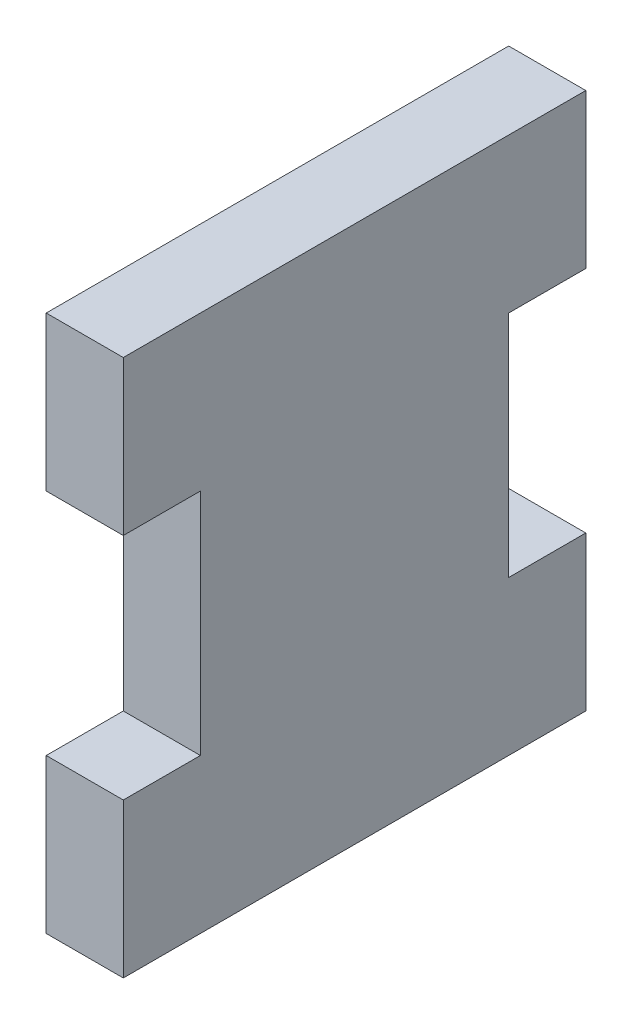
ISO-10303-21;
HEADER;
FILE_DESCRIPTION(('STEP AP214'),'2;1');
FILE_NAME('part.step','',(''),(''),'','','');
FILE_SCHEMA(('AUTOMOTIVE_DESIGN { 1 0 10303 214 1 1 1 1 }'));
ENDSEC;
DATA;
#1=APPLICATION_CONTEXT('core data for automotive mechanical design processes');
#2=APPLICATION_PROTOCOL_DEFINITION('international standard','automotive_design',2000,#1);
#3=PRODUCT_CONTEXT('',#1,'mechanical');
#4=PRODUCT('Part','Part','',(#3));
#5=PRODUCT_RELATED_PRODUCT_CATEGORY('part','',(#4));
#6=PRODUCT_DEFINITION_FORMATION('','',#4);
#7=PRODUCT_DEFINITION_CONTEXT('part definition',#1,'design');
#8=PRODUCT_DEFINITION('design','',#6,#7);
#9=PRODUCT_DEFINITION_SHAPE('','',#8);
#10=(LENGTH_UNIT() NAMED_UNIT(*) SI_UNIT(.MILLI.,.METRE.));
#11=(NAMED_UNIT(*) PLANE_ANGLE_UNIT() SI_UNIT($,.RADIAN.));
#12=(NAMED_UNIT(*) SI_UNIT($,.STERADIAN.) SOLID_ANGLE_UNIT());
#13=UNCERTAINTY_MEASURE_WITH_UNIT(LENGTH_MEASURE(1.E-05),#10,'distance_accuracy_value','');
#14=(GEOMETRIC_REPRESENTATION_CONTEXT(3) GLOBAL_UNCERTAINTY_ASSIGNED_CONTEXT((#13)) GLOBAL_UNIT_ASSIGNED_CONTEXT((#10,
#11,#12)) REPRESENTATION_CONTEXT('',''));
#15=CARTESIAN_POINT('',(0.,0.,0.));
#16=DIRECTION('',(0.,0.,1.));
#17=DIRECTION('',(1.,0.,0.));
#18=AXIS2_PLACEMENT_3D('',#15,#16,#17);
#19=CARTESIAN_POINT('',(170.787635416825,62.3441732811467,-19.05));
#20=DIRECTION('',(0.,0.,1.));
#21=DIRECTION('',(1.,0.,0.));
#22=AXIS2_PLACEMENT_3D('',#19,#20,#21);
#23=PLANE('',#22);
#24=DIRECTION('',(0.,-1.,0.));
#25=VECTOR('',#24,1.);
#26=CARTESIAN_POINT('',(135.125966969491,74.418452209099,-19.05));
#27=LINE('',#26,#25);
#28=CARTESIAN_POINT('',(135.125966969491,96.5527379233846,-19.05));
#29=VERTEX_POINT('',#28);
#30=CARTESIAN_POINT('',(135.125966969491,90.2027379233846,-19.05));
#31=VERTEX_POINT('',#30);
#32=EDGE_CURVE('E199',#29,#31,#27,.T.);
#33=ORIENTED_EDGE('',*,*,#32,.T.);
#34=DIRECTION('',(-1.,0.,0.));
#35=VECTOR('',#34,1.);
#36=CARTESIAN_POINT('',(170.787635416825,90.2027379233846,-19.05));
#37=LINE('',#36,#35);
#38=CARTESIAN_POINT('',(131.950966969491,90.2027379233846,-19.05));
#39=VERTEX_POINT('',#38);
#40=EDGE_CURVE('E11',#31,#39,#37,.T.);
#41=ORIENTED_EDGE('',*,*,#40,.T.);
#42=DIRECTION('',(0.,-1.,0.));
#43=VECTOR('',#42,1.);
#44=CARTESIAN_POINT('',(131.950966969491,74.418452209099,-19.05));
#45=LINE('',#44,#43);
#46=CARTESIAN_POINT('',(131.950966969491,96.5527379233846,-19.05));
#47=VERTEX_POINT('',#46);
#48=EDGE_CURVE('E193',#47,#39,#45,.T.);
#49=ORIENTED_EDGE('',*,*,#48,.F.);
#50=DIRECTION('',(1.,0.,0.));
#51=VECTOR('',#50,1.);
#52=CARTESIAN_POINT('',(135.125966969491,96.5527379233846,-19.05));
#53=LINE('',#52,#51);
#54=EDGE_CURVE('E180',#47,#29,#53,.T.);
#55=ORIENTED_EDGE('',*,*,#54,.T.);
#56=EDGE_LOOP('',(#33,#41,#49,#55));
#57=FACE_BOUND('',#56,.T.);
#58=ADVANCED_FACE('F33',(#57),#23,.F.);
#59=CARTESIAN_POINT('',(0.,0.,0.));
#60=DIRECTION('',(0.,0.,-1.));
#61=DIRECTION('',(-1.,0.,0.));
#62=AXIS2_PLACEMENT_3D('',#59,#60,#61);
#63=PLANE('',#62);
#64=DIRECTION('',(0.,1.,0.));
#65=VECTOR('',#64,1.);
#66=CARTESIAN_POINT('',(131.950966969491,74.418452209099,0.));
#67=LINE('',#66,#65);
#68=CARTESIAN_POINT('',(131.950966969491,90.2027379233846,0.));
#69=VERTEX_POINT('',#68);
#70=CARTESIAN_POINT('',(131.950966969491,96.5527379233846,0.));
#71=VERTEX_POINT('',#70);
#72=EDGE_CURVE('E185',#69,#71,#67,.T.);
#73=ORIENTED_EDGE('',*,*,#72,.F.);
#74=DIRECTION('',(1.,0.,0.));
#75=VECTOR('',#74,1.);
#76=CARTESIAN_POINT('',(0.,90.2027379233846,0.));
#77=LINE('',#76,#75);
#78=CARTESIAN_POINT('',(135.125966969491,90.2027379233846,0.));
#79=VERTEX_POINT('',#78);
#80=EDGE_CURVE('E211',#69,#79,#77,.T.);
#81=ORIENTED_EDGE('',*,*,#80,.T.);
#82=DIRECTION('',(0.,1.,0.));
#83=VECTOR('',#82,1.);
#84=CARTESIAN_POINT('',(135.125966969491,74.418452209099,0.));
#85=LINE('',#84,#83);
#86=CARTESIAN_POINT('',(135.125966969491,96.5527379233846,0.));
#87=VERTEX_POINT('',#86);
#88=EDGE_CURVE('E177',#79,#87,#85,.T.);
#89=ORIENTED_EDGE('',*,*,#88,.T.);
#90=DIRECTION('',(-1.,0.,0.));
#91=VECTOR('',#90,1.);
#92=CARTESIAN_POINT('',(135.125966969491,96.5527379233846,0.));
#93=LINE('',#92,#91);
#94=EDGE_CURVE('E176',#87,#71,#93,.T.);
#95=ORIENTED_EDGE('',*,*,#94,.T.);
#96=EDGE_LOOP('',(#73,#81,#89,#95));
#97=FACE_BOUND('',#96,.T.);
#98=ADVANCED_FACE('F230',(#97),#63,.F.);
#99=CARTESIAN_POINT('',(135.125966969491,74.418452209099,-41.4108414215929));
#100=DIRECTION('',(0.,1.,0.));
#101=DIRECTION('',(0.,0.,1.));
#102=AXIS2_PLACEMENT_3D('',#99,#100,#101);
#103=PLANE('',#102);
#104=DIRECTION('',(0.,0.,1.));
#105=VECTOR('',#104,1.);
#106=CARTESIAN_POINT('',(131.950966969491,74.418452209099,-41.4108414215929));
#107=LINE('',#106,#105);
#108=CARTESIAN_POINT('',(131.950966969491,74.418452209099,-19.05));
#109=VERTEX_POINT('',#108);
#110=CARTESIAN_POINT('',(131.950966969491,74.418452209099,0.));
#111=VERTEX_POINT('',#110);
#112=EDGE_CURVE('E196',#109,#111,#107,.T.);
#113=ORIENTED_EDGE('',*,*,#112,.F.);
#114=DIRECTION('',(1.,0.,0.));
#115=VECTOR('',#114,1.);
#116=CARTESIAN_POINT('',(135.125966969491,74.418452209099,-19.05));
#117=LINE('',#116,#115);
#118=CARTESIAN_POINT('',(135.125966969491,74.418452209099,-19.05));
#119=VERTEX_POINT('',#118);
#120=EDGE_CURVE('E172',#109,#119,#117,.T.);
#121=ORIENTED_EDGE('',*,*,#120,.T.);
#122=DIRECTION('',(0.,0.,1.));
#123=VECTOR('',#122,1.);
#124=CARTESIAN_POINT('',(135.125966969491,74.418452209099,-41.4108414215929));
#125=LINE('',#124,#123);
#126=CARTESIAN_POINT('',(135.125966969491,74.418452209099,0.));
#127=VERTEX_POINT('',#126);
#128=EDGE_CURVE('E190',#119,#127,#125,.T.);
#129=ORIENTED_EDGE('',*,*,#128,.T.);
#130=DIRECTION('',(-1.,0.,0.));
#131=VECTOR('',#130,1.);
#132=CARTESIAN_POINT('',(135.125966969491,74.418452209099,0.));
#133=LINE('',#132,#131);
#134=EDGE_CURVE('E186',#127,#111,#133,.T.);
#135=ORIENTED_EDGE('',*,*,#134,.T.);
#136=EDGE_LOOP('',(#113,#121,#129,#135));
#137=FACE_BOUND('',#136,.T.);
#138=ADVANCED_FACE('F247',(#137),#103,.F.);
#139=CARTESIAN_POINT('',(131.950966969491,74.418452209099,-41.4108414215929));
#140=DIRECTION('',(1.,0.,0.));
#141=DIRECTION('',(0.,0.,-1.));
#142=AXIS2_PLACEMENT_3D('',#139,#140,#141);
#143=PLANE('',#142);
#144=ORIENTED_EDGE('',*,*,#48,.T.);
#145=DIRECTION('',(0.,0.,1.));
#146=VECTOR('',#145,1.);
#147=CARTESIAN_POINT('',(131.950966969491,90.2027379233846,-41.4108414215929));
#148=LINE('',#147,#146);
#149=CARTESIAN_POINT('',(131.950966969491,90.2027379233846,-15.875));
#150=VERTEX_POINT('',#149);
#151=EDGE_CURVE('E148',#39,#150,#148,.T.);
#152=ORIENTED_EDGE('',*,*,#151,.T.);
#153=DIRECTION('',(0.,-1.,0.));
#154=VECTOR('',#153,1.);
#155=CARTESIAN_POINT('',(131.950966969491,74.418452209099,-15.875));
#156=LINE('',#155,#154);
#157=CARTESIAN_POINT('',(131.950966969491,80.768452209099,-15.875));
#158=VERTEX_POINT('',#157);
#159=EDGE_CURVE('E151',#150,#158,#156,.T.);
#160=ORIENTED_EDGE('',*,*,#159,.T.);
#161=DIRECTION('',(0.,0.,-1.));
#162=VECTOR('',#161,1.);
#163=CARTESIAN_POINT('',(131.950966969491,80.768452209099,-41.4108414215929));
#164=LINE('',#163,#162);
#165=CARTESIAN_POINT('',(131.950966969491,80.768452209099,-19.05));
#166=VERTEX_POINT('',#165);
#167=EDGE_CURVE('E125',#158,#166,#164,.T.);
#168=ORIENTED_EDGE('',*,*,#167,.T.);
#169=EDGE_CURVE('E189',#166,#109,#45,.T.);
#170=ORIENTED_EDGE('',*,*,#169,.T.);
#171=ORIENTED_EDGE('',*,*,#112,.T.);
#172=CARTESIAN_POINT('',(131.950966969491,80.768452209099,0.));
#173=VERTEX_POINT('',#172);
#174=EDGE_CURVE('E181',#111,#173,#67,.T.);
#175=ORIENTED_EDGE('',*,*,#174,.T.);
#176=DIRECTION('',(0.,0.,-1.));
#177=VECTOR('',#176,1.);
#178=CARTESIAN_POINT('',(131.950966969491,80.768452209099,-41.4108414215929));
#179=LINE('',#178,#177);
#180=CARTESIAN_POINT('',(131.950966969491,80.768452209099,-3.175));
#181=VERTEX_POINT('',#180);
#182=EDGE_CURVE('E56',#173,#181,#179,.T.);
#183=ORIENTED_EDGE('',*,*,#182,.T.);
#184=DIRECTION('',(0.,1.,0.));
#185=VECTOR('',#184,1.);
#186=CARTESIAN_POINT('',(131.950966969491,74.418452209099,-3.175));
#187=LINE('',#186,#185);
#188=CARTESIAN_POINT('',(131.950966969491,90.2027379233846,-3.175));
#189=VERTEX_POINT('',#188);
#190=EDGE_CURVE('E169',#181,#189,#187,.T.);
#191=ORIENTED_EDGE('',*,*,#190,.T.);
#192=DIRECTION('',(0.,0.,1.));
#193=VECTOR('',#192,1.);
#194=CARTESIAN_POINT('',(131.950966969491,90.2027379233846,-41.4108414215929));
#195=LINE('',#194,#193);
#196=EDGE_CURVE('E166',#189,#69,#195,.T.);
#197=ORIENTED_EDGE('',*,*,#196,.T.);
#198=ORIENTED_EDGE('',*,*,#72,.T.);
#199=DIRECTION('',(0.,0.,1.));
#200=VECTOR('',#199,1.);
#201=CARTESIAN_POINT('',(131.950966969491,96.5527379233846,-41.4108414215929));
#202=LINE('',#201,#200);
#203=EDGE_CURVE('E184',#47,#71,#202,.T.);
#204=ORIENTED_EDGE('',*,*,#203,.F.);
#205=EDGE_LOOP('',(#144,#152,#160,#168,#170,#171,#175,#183,#191,#197,#198,#204));
#206=FACE_BOUND('',#205,.T.);
#207=ADVANCED_FACE('F217',(#206),#143,.F.);
#208=CARTESIAN_POINT('',(135.125966969491,96.5527379233846,-41.4108414215929));
#209=DIRECTION('',(0.,1.,0.));
#210=DIRECTION('',(0.,0.,1.));
#211=AXIS2_PLACEMENT_3D('',#208,#209,#210);
#212=PLANE('',#211);
#213=ORIENTED_EDGE('',*,*,#54,.F.);
#214=ORIENTED_EDGE('',*,*,#203,.T.);
#215=ORIENTED_EDGE('',*,*,#94,.F.);
#216=DIRECTION('',(0.,0.,1.));
#217=VECTOR('',#216,1.);
#218=CARTESIAN_POINT('',(135.125966969491,96.5527379233846,-41.4108414215929));
#219=LINE('',#218,#217);
#220=EDGE_CURVE('E206',#29,#87,#219,.T.);
#221=ORIENTED_EDGE('',*,*,#220,.F.);
#222=EDGE_LOOP('',(#213,#214,#215,#221));
#223=FACE_BOUND('',#222,.T.);
#224=ADVANCED_FACE('F226',(#223),#212,.T.);
#225=CARTESIAN_POINT('',(135.125966969491,74.418452209099,-41.4108414215929));
#226=DIRECTION('',(1.,0.,0.));
#227=DIRECTION('',(0.,0.,-1.));
#228=AXIS2_PLACEMENT_3D('',#225,#226,#227);
#229=PLANE('',#228);
#230=DIRECTION('',(0.,0.,1.));
#231=VECTOR('',#230,1.);
#232=CARTESIAN_POINT('',(135.125966969491,90.2027379233846,-15.875));
#233=LINE('',#232,#231);
#234=CARTESIAN_POINT('',(135.125966969491,90.2027379233846,-15.875));
#235=VERTEX_POINT('',#234);
#236=EDGE_CURVE('E129',#31,#235,#233,.T.);
#237=ORIENTED_EDGE('',*,*,#236,.F.);
#238=ORIENTED_EDGE('',*,*,#32,.F.);
#239=ORIENTED_EDGE('',*,*,#220,.T.);
#240=ORIENTED_EDGE('',*,*,#88,.F.);
#241=DIRECTION('',(0.,0.,1.));
#242=VECTOR('',#241,1.);
#243=CARTESIAN_POINT('',(135.125966969491,90.2027379233846,0.));
#244=LINE('',#243,#242);
#245=CARTESIAN_POINT('',(135.125966969491,90.2027379233846,-3.175));
#246=VERTEX_POINT('',#245);
#247=EDGE_CURVE('E159',#246,#79,#244,.T.);
#248=ORIENTED_EDGE('',*,*,#247,.F.);
#249=DIRECTION('',(0.,1.,0.));
#250=VECTOR('',#249,1.);
#251=CARTESIAN_POINT('',(135.125966969491,90.2027379233846,-3.175));
#252=LINE('',#251,#250);
#253=CARTESIAN_POINT('',(135.125966969491,80.768452209099,-3.175));
#254=VERTEX_POINT('',#253);
#255=EDGE_CURVE('E156',#254,#246,#252,.T.);
#256=ORIENTED_EDGE('',*,*,#255,.F.);
#257=DIRECTION('',(0.,0.,-1.));
#258=VECTOR('',#257,1.);
#259=CARTESIAN_POINT('',(135.125966969491,80.768452209099,0.));
#260=LINE('',#259,#258);
#261=CARTESIAN_POINT('',(135.125966969491,80.768452209099,0.));
#262=VERTEX_POINT('',#261);
#263=EDGE_CURVE('E153',#262,#254,#260,.T.);
#264=ORIENTED_EDGE('',*,*,#263,.F.);
#265=EDGE_CURVE('E173',#127,#262,#85,.T.);
#266=ORIENTED_EDGE('',*,*,#265,.F.);
#267=ORIENTED_EDGE('',*,*,#128,.F.);
#268=CARTESIAN_POINT('',(135.125966969491,80.768452209099,-19.05));
#269=VERTEX_POINT('',#268);
#270=EDGE_CURVE('E142',#269,#119,#27,.T.);
#271=ORIENTED_EDGE('',*,*,#270,.F.);
#272=DIRECTION('',(0.,0.,-1.));
#273=VECTOR('',#272,1.);
#274=CARTESIAN_POINT('',(135.125966969491,80.768452209099,-15.875));
#275=LINE('',#274,#273);
#276=CARTESIAN_POINT('',(135.125966969491,80.768452209099,-15.875));
#277=VERTEX_POINT('',#276);
#278=EDGE_CURVE('E48',#277,#269,#275,.T.);
#279=ORIENTED_EDGE('',*,*,#278,.F.);
#280=DIRECTION('',(0.,-1.,0.));
#281=VECTOR('',#280,1.);
#282=CARTESIAN_POINT('',(135.125966969491,80.768452209099,-15.875));
#283=LINE('',#282,#281);
#284=EDGE_CURVE('E132',#235,#277,#283,.T.);
#285=ORIENTED_EDGE('',*,*,#284,.F.);
#286=EDGE_LOOP('',(#237,#238,#239,#240,#248,#256,#264,#266,#267,#271,#279,#285));
#287=FACE_BOUND('',#286,.T.);
#288=ADVANCED_FACE('F140',(#287),#229,.T.);
#289=ORIENTED_EDGE('',*,*,#265,.T.);
#290=DIRECTION('',(-1.,0.,0.));
#291=VECTOR('',#290,1.);
#292=CARTESIAN_POINT('',(0.,80.768452209099,0.));
#293=LINE('',#292,#291);
#294=EDGE_CURVE('E202',#262,#173,#293,.T.);
#295=ORIENTED_EDGE('',*,*,#294,.T.);
#296=ORIENTED_EDGE('',*,*,#174,.F.);
#297=ORIENTED_EDGE('',*,*,#134,.F.);
#298=EDGE_LOOP('',(#289,#295,#296,#297));
#299=FACE_BOUND('',#298,.T.);
#300=ADVANCED_FACE('F244',(#299),#63,.F.);
#301=ORIENTED_EDGE('',*,*,#169,.F.);
#302=DIRECTION('',(1.,0.,0.));
#303=VECTOR('',#302,1.);
#304=CARTESIAN_POINT('',(170.787635416825,80.768452209099,-19.05));
#305=LINE('',#304,#303);
#306=EDGE_CURVE('E41',#166,#269,#305,.T.);
#307=ORIENTED_EDGE('',*,*,#306,.T.);
#308=ORIENTED_EDGE('',*,*,#270,.T.);
#309=ORIENTED_EDGE('',*,*,#120,.F.);
#310=EDGE_LOOP('',(#301,#307,#308,#309));
#311=FACE_BOUND('',#310,.T.);
#312=ADVANCED_FACE('F35',(#311),#23,.F.);
#313=CARTESIAN_POINT('',(130.045966969491,90.2027379233846,-3.175));
#314=DIRECTION('',(0.,0.,-1.));
#315=DIRECTION('',(-1.,0.,0.));
#316=AXIS2_PLACEMENT_3D('',#313,#314,#315);
#317=PLANE('',#316);
#318=DIRECTION('',(1.,0.,0.));
#319=VECTOR('',#318,1.);
#320=CARTESIAN_POINT('',(130.045966969491,80.768452209099,-3.175));
#321=LINE('',#320,#319);
#322=EDGE_CURVE('E161',#181,#254,#321,.T.);
#323=ORIENTED_EDGE('',*,*,#322,.T.);
#324=ORIENTED_EDGE('',*,*,#255,.T.);
#325=DIRECTION('',(1.,0.,0.));
#326=VECTOR('',#325,1.);
#327=CARTESIAN_POINT('',(130.045966969491,90.2027379233846,-3.175));
#328=LINE('',#327,#326);
#329=EDGE_CURVE('E162',#189,#246,#328,.T.);
#330=ORIENTED_EDGE('',*,*,#329,.F.);
#331=ORIENTED_EDGE('',*,*,#190,.F.);
#332=EDGE_LOOP('',(#323,#324,#330,#331));
#333=FACE_BOUND('',#332,.T.);
#334=ADVANCED_FACE('F239',(#333),#317,.F.);
#335=CARTESIAN_POINT('',(130.045966969491,90.2027379233846,0.));
#336=DIRECTION('',(0.,1.,0.));
#337=DIRECTION('',(0.,0.,1.));
#338=AXIS2_PLACEMENT_3D('',#335,#336,#337);
#339=PLANE('',#338);
#340=ORIENTED_EDGE('',*,*,#329,.T.);
#341=ORIENTED_EDGE('',*,*,#247,.T.);
#342=ORIENTED_EDGE('',*,*,#80,.F.);
#343=ORIENTED_EDGE('',*,*,#196,.F.);
#344=EDGE_LOOP('',(#340,#341,#342,#343));
#345=FACE_BOUND('',#344,.T.);
#346=ADVANCED_FACE('F236',(#345),#339,.F.);
#347=CARTESIAN_POINT('',(130.045966969491,80.768452209099,0.));
#348=DIRECTION('',(0.,-1.,0.));
#349=DIRECTION('',(0.,0.,-1.));
#350=AXIS2_PLACEMENT_3D('',#347,#348,#349);
#351=PLANE('',#350);
#352=ORIENTED_EDGE('',*,*,#294,.F.);
#353=ORIENTED_EDGE('',*,*,#263,.T.);
#354=ORIENTED_EDGE('',*,*,#322,.F.);
#355=ORIENTED_EDGE('',*,*,#182,.F.);
#356=EDGE_LOOP('',(#352,#353,#354,#355));
#357=FACE_BOUND('',#356,.T.);
#358=ADVANCED_FACE('F240',(#357),#351,.F.);
#359=CARTESIAN_POINT('',(130.045966969491,80.768452209099,-15.875));
#360=DIRECTION('',(0.,0.,1.));
#361=DIRECTION('',(1.,0.,0.));
#362=AXIS2_PLACEMENT_3D('',#359,#360,#361);
#363=PLANE('',#362);
#364=DIRECTION('',(1.,0.,0.));
#365=VECTOR('',#364,1.);
#366=CARTESIAN_POINT('',(130.045966969491,90.2027379233846,-15.875));
#367=LINE('',#366,#365);
#368=EDGE_CURVE('E128',#150,#235,#367,.T.);
#369=ORIENTED_EDGE('',*,*,#368,.T.);
#370=ORIENTED_EDGE('',*,*,#284,.T.);
#371=DIRECTION('',(1.,0.,0.));
#372=VECTOR('',#371,1.);
#373=CARTESIAN_POINT('',(130.045966969491,80.768452209099,-15.875));
#374=LINE('',#373,#372);
#375=EDGE_CURVE('E121',#158,#277,#374,.T.);
#376=ORIENTED_EDGE('',*,*,#375,.F.);
#377=ORIENTED_EDGE('',*,*,#159,.F.);
#378=EDGE_LOOP('',(#369,#370,#376,#377));
#379=FACE_BOUND('',#378,.T.);
#380=ADVANCED_FACE('F133',(#379),#363,.F.);
#381=CARTESIAN_POINT('',(130.045966969491,90.2027379233846,-15.875));
#382=DIRECTION('',(0.,1.,0.));
#383=DIRECTION('',(0.,0.,1.));
#384=AXIS2_PLACEMENT_3D('',#381,#382,#383);
#385=PLANE('',#384);
#386=ORIENTED_EDGE('',*,*,#40,.F.);
#387=ORIENTED_EDGE('',*,*,#236,.T.);
#388=ORIENTED_EDGE('',*,*,#368,.F.);
#389=ORIENTED_EDGE('',*,*,#151,.F.);
#390=EDGE_LOOP('',(#386,#387,#388,#389));
#391=FACE_BOUND('',#390,.T.);
#392=ADVANCED_FACE('F220',(#391),#385,.F.);
#393=CARTESIAN_POINT('',(130.045966969491,80.768452209099,-15.875));
#394=DIRECTION('',(0.,-1.,0.));
#395=DIRECTION('',(0.,0.,-1.));
#396=AXIS2_PLACEMENT_3D('',#393,#394,#395);
#397=PLANE('',#396);
#398=ORIENTED_EDGE('',*,*,#375,.T.);
#399=ORIENTED_EDGE('',*,*,#278,.T.);
#400=ORIENTED_EDGE('',*,*,#306,.F.);
#401=ORIENTED_EDGE('',*,*,#167,.F.);
#402=EDGE_LOOP('',(#398,#399,#400,#401));
#403=FACE_BOUND('',#402,.T.);
#404=ADVANCED_FACE('F123',(#403),#397,.F.);
#405=CLOSED_SHELL('',(#58,#98,#138,#207,#224,#288,#300,#312,#334,#346,#358,#380,#392,#404));
#406=MANIFOLD_SOLID_BREP('B2',#405);
#407=ADVANCED_BREP_SHAPE_REPRESENTATION('',(#18,#406),#14);
#408=SHAPE_DEFINITION_REPRESENTATION(#9,#407);
ENDSEC;
END-ISO-10303-21;
